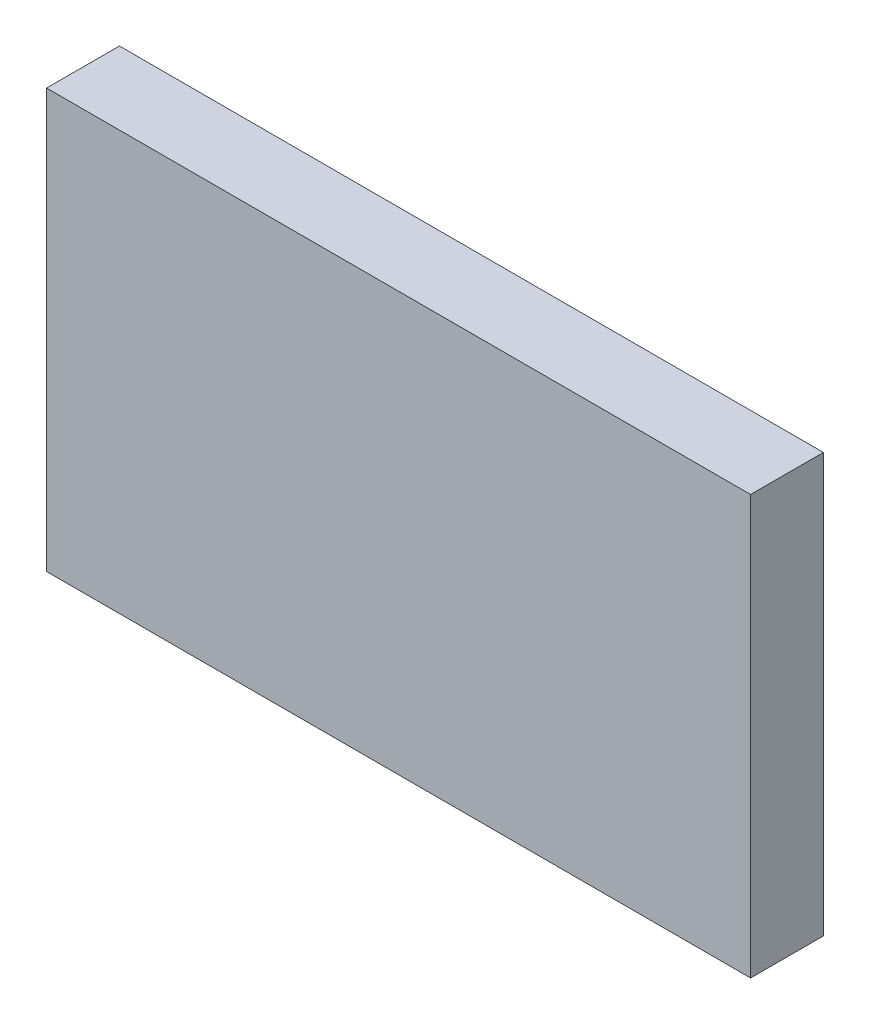
ISO-10303-21;
HEADER;
FILE_DESCRIPTION(('STEP AP214'),'2;1');
FILE_NAME('part.step','',(''),(''),'','','');
FILE_SCHEMA(('AUTOMOTIVE_DESIGN { 1 0 10303 214 1 1 1 1 }'));
ENDSEC;
DATA;
#1=APPLICATION_CONTEXT('core data for automotive mechanical design processes');
#2=APPLICATION_PROTOCOL_DEFINITION('international standard','automotive_design',2000,#1);
#3=PRODUCT_CONTEXT('',#1,'mechanical');
#4=PRODUCT('Part','Part','',(#3));
#5=PRODUCT_RELATED_PRODUCT_CATEGORY('part','',(#4));
#6=PRODUCT_DEFINITION_FORMATION('','',#4);
#7=PRODUCT_DEFINITION_CONTEXT('part definition',#1,'design');
#8=PRODUCT_DEFINITION('design','',#6,#7);
#9=PRODUCT_DEFINITION_SHAPE('','',#8);
#10=(LENGTH_UNIT() NAMED_UNIT(*) SI_UNIT(.MILLI.,.METRE.));
#11=(NAMED_UNIT(*) PLANE_ANGLE_UNIT() SI_UNIT($,.RADIAN.));
#12=(NAMED_UNIT(*) SI_UNIT($,.STERADIAN.) SOLID_ANGLE_UNIT());
#13=UNCERTAINTY_MEASURE_WITH_UNIT(LENGTH_MEASURE(1.E-05),#10,'distance_accuracy_value','');
#14=(GEOMETRIC_REPRESENTATION_CONTEXT(3) GLOBAL_UNCERTAINTY_ASSIGNED_CONTEXT((#13)) GLOBAL_UNIT_ASSIGNED_CONTEXT((#10,
#11,#12)) REPRESENTATION_CONTEXT('',''));
#15=CARTESIAN_POINT('',(0.,0.,0.));
#16=DIRECTION('',(0.,0.,1.));
#17=DIRECTION('',(1.,0.,0.));
#18=AXIS2_PLACEMENT_3D('',#15,#16,#17);
#19=CARTESIAN_POINT('',(29.,-17.25,6.));
#20=DIRECTION('',(-1.,0.,0.));
#21=DIRECTION('',(0.,0.,1.));
#22=AXIS2_PLACEMENT_3D('',#19,#20,#21);
#23=PLANE('',#22);
#24=DIRECTION('',(0.,1.,0.));
#25=VECTOR('',#24,1.);
#26=CARTESIAN_POINT('',(29.,-17.25,0.));
#27=LINE('',#26,#25);
#28=CARTESIAN_POINT('',(29.,-17.25,0.));
#29=VERTEX_POINT('',#28);
#30=CARTESIAN_POINT('',(29.,17.25,0.));
#31=VERTEX_POINT('',#30);
#32=EDGE_CURVE('E97',#29,#31,#27,.T.);
#33=ORIENTED_EDGE('',*,*,#32,.T.);
#34=DIRECTION('',(0.,0.,-1.));
#35=VECTOR('',#34,1.);
#36=CARTESIAN_POINT('',(29.,17.25,6.));
#37=LINE('',#36,#35);
#38=CARTESIAN_POINT('',(29.,17.25,6.));
#39=VERTEX_POINT('',#38);
#40=EDGE_CURVE('E11',#39,#31,#37,.T.);
#41=ORIENTED_EDGE('',*,*,#40,.F.);
#42=DIRECTION('',(0.,1.,0.));
#43=VECTOR('',#42,1.);
#44=CARTESIAN_POINT('',(29.,-17.25,6.));
#45=LINE('',#44,#43);
#46=CARTESIAN_POINT('',(29.,-17.25,6.));
#47=VERTEX_POINT('',#46);
#48=EDGE_CURVE('E85',#47,#39,#45,.T.);
#49=ORIENTED_EDGE('',*,*,#48,.F.);
#50=DIRECTION('',(0.,0.,-1.));
#51=VECTOR('',#50,1.);
#52=CARTESIAN_POINT('',(29.,-17.25,6.));
#53=LINE('',#52,#51);
#54=EDGE_CURVE('E93',#47,#29,#53,.T.);
#55=ORIENTED_EDGE('',*,*,#54,.T.);
#56=EDGE_LOOP('',(#33,#41,#49,#55));
#57=FACE_BOUND('',#56,.T.);
#58=ADVANCED_FACE('F34',(#57),#23,.F.);
#59=CARTESIAN_POINT('',(-29.,17.25,6.));
#60=DIRECTION('',(0.,-1.,0.));
#61=DIRECTION('',(0.,0.,-1.));
#62=AXIS2_PLACEMENT_3D('',#59,#60,#61);
#63=PLANE('',#62);
#64=DIRECTION('',(-1.,0.,0.));
#65=VECTOR('',#64,1.);
#66=CARTESIAN_POINT('',(-29.,17.25,0.));
#67=LINE('',#66,#65);
#68=CARTESIAN_POINT('',(-29.,17.25,0.));
#69=VERTEX_POINT('',#68);
#70=EDGE_CURVE('E89',#31,#69,#67,.T.);
#71=ORIENTED_EDGE('',*,*,#70,.T.);
#72=DIRECTION('',(0.,0.,-1.));
#73=VECTOR('',#72,1.);
#74=CARTESIAN_POINT('',(-29.,17.25,6.));
#75=LINE('',#74,#73);
#76=CARTESIAN_POINT('',(-29.,17.25,6.));
#77=VERTEX_POINT('',#76);
#78=EDGE_CURVE('E42',#77,#69,#75,.T.);
#79=ORIENTED_EDGE('',*,*,#78,.F.);
#80=DIRECTION('',(-1.,0.,0.));
#81=VECTOR('',#80,1.);
#82=CARTESIAN_POINT('',(-29.,17.25,6.));
#83=LINE('',#82,#81);
#84=EDGE_CURVE('E80',#39,#77,#83,.T.);
#85=ORIENTED_EDGE('',*,*,#84,.F.);
#86=ORIENTED_EDGE('',*,*,#40,.T.);
#87=EDGE_LOOP('',(#71,#79,#85,#86));
#88=FACE_BOUND('',#87,.T.);
#89=ADVANCED_FACE('F88',(#88),#63,.F.);
#90=CARTESIAN_POINT('',(-29.,-17.25,6.));
#91=DIRECTION('',(1.,0.,0.));
#92=DIRECTION('',(0.,0.,-1.));
#93=AXIS2_PLACEMENT_3D('',#90,#91,#92);
#94=PLANE('',#93);
#95=DIRECTION('',(0.,-1.,0.));
#96=VECTOR('',#95,1.);
#97=CARTESIAN_POINT('',(-29.,-17.25,0.));
#98=LINE('',#97,#96);
#99=CARTESIAN_POINT('',(-29.,-17.25,0.));
#100=VERTEX_POINT('',#99);
#101=EDGE_CURVE('E67',#69,#100,#98,.T.);
#102=ORIENTED_EDGE('',*,*,#101,.T.);
#103=DIRECTION('',(0.,0.,-1.));
#104=VECTOR('',#103,1.);
#105=CARTESIAN_POINT('',(-29.,-17.25,6.));
#106=LINE('',#105,#104);
#107=CARTESIAN_POINT('',(-29.,-17.25,6.));
#108=VERTEX_POINT('',#107);
#109=EDGE_CURVE('E90',#108,#100,#106,.T.);
#110=ORIENTED_EDGE('',*,*,#109,.F.);
#111=DIRECTION('',(0.,-1.,0.));
#112=VECTOR('',#111,1.);
#113=CARTESIAN_POINT('',(-29.,-17.25,6.));
#114=LINE('',#113,#112);
#115=EDGE_CURVE('E83',#77,#108,#114,.T.);
#116=ORIENTED_EDGE('',*,*,#115,.F.);
#117=ORIENTED_EDGE('',*,*,#78,.T.);
#118=EDGE_LOOP('',(#102,#110,#116,#117));
#119=FACE_BOUND('',#118,.T.);
#120=ADVANCED_FACE('F91',(#119),#94,.F.);
#121=CARTESIAN_POINT('',(-29.,-17.25,6.));
#122=DIRECTION('',(0.,1.,0.));
#123=DIRECTION('',(0.,0.,1.));
#124=AXIS2_PLACEMENT_3D('',#121,#122,#123);
#125=PLANE('',#124);
#126=DIRECTION('',(1.,0.,0.));
#127=VECTOR('',#126,1.);
#128=CARTESIAN_POINT('',(-29.,-17.25,0.));
#129=LINE('',#128,#127);
#130=EDGE_CURVE('E73',#100,#29,#129,.T.);
#131=ORIENTED_EDGE('',*,*,#130,.T.);
#132=ORIENTED_EDGE('',*,*,#54,.F.);
#133=DIRECTION('',(1.,0.,0.));
#134=VECTOR('',#133,1.);
#135=CARTESIAN_POINT('',(-29.,-17.25,6.));
#136=LINE('',#135,#134);
#137=EDGE_CURVE('E50',#108,#47,#136,.T.);
#138=ORIENTED_EDGE('',*,*,#137,.F.);
#139=ORIENTED_EDGE('',*,*,#109,.T.);
#140=EDGE_LOOP('',(#131,#132,#138,#139));
#141=FACE_BOUND('',#140,.T.);
#142=ADVANCED_FACE('F104',(#141),#125,.F.);
#143=CARTESIAN_POINT('',(0.,0.,6.));
#144=DIRECTION('',(0.,0.,-1.));
#145=DIRECTION('',(-1.,0.,0.));
#146=AXIS2_PLACEMENT_3D('',#143,#144,#145);
#147=PLANE('',#146);
#148=ORIENTED_EDGE('',*,*,#48,.T.);
#149=ORIENTED_EDGE('',*,*,#84,.T.);
#150=ORIENTED_EDGE('',*,*,#115,.T.);
#151=ORIENTED_EDGE('',*,*,#137,.T.);
#152=EDGE_LOOP('',(#148,#149,#150,#151));
#153=FACE_BOUND('',#152,.T.);
#154=ADVANCED_FACE('F81',(#153),#147,.F.);
#155=CARTESIAN_POINT('',(0.,0.,0.));
#156=DIRECTION('',(0.,0.,-1.));
#157=DIRECTION('',(-1.,0.,0.));
#158=AXIS2_PLACEMENT_3D('',#155,#156,#157);
#159=PLANE('',#158);
#160=ORIENTED_EDGE('',*,*,#32,.F.);
#161=ORIENTED_EDGE('',*,*,#130,.F.);
#162=ORIENTED_EDGE('',*,*,#101,.F.);
#163=ORIENTED_EDGE('',*,*,#70,.F.);
#164=EDGE_LOOP('',(#160,#161,#162,#163));
#165=FACE_BOUND('',#164,.T.);
#166=ADVANCED_FACE('F107',(#165),#159,.T.);
#167=CLOSED_SHELL('',(#58,#89,#120,#142,#154,#166));
#168=MANIFOLD_SOLID_BREP('B2',#167);
#169=ADVANCED_BREP_SHAPE_REPRESENTATION('',(#18,#168),#14);
#170=SHAPE_DEFINITION_REPRESENTATION(#9,#169);
ENDSEC;
END-ISO-10303-21;
